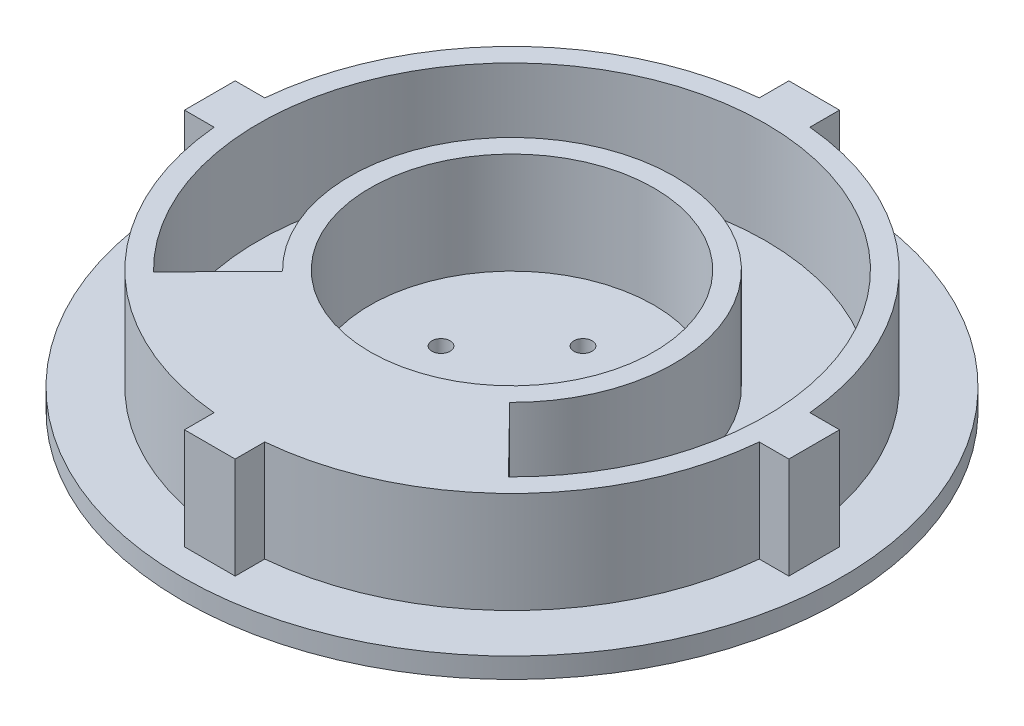
ISO-10303-21;
HEADER;
FILE_DESCRIPTION(('STEP AP214'),'2;1');
FILE_NAME('part.step','',(''),(''),'','','');
FILE_SCHEMA(('AUTOMOTIVE_DESIGN { 1 0 10303 214 1 1 1 1 }'));
ENDSEC;
DATA;
#1=APPLICATION_CONTEXT('core data for automotive mechanical design processes');
#2=APPLICATION_PROTOCOL_DEFINITION('international standard','automotive_design',2000,#1);
#3=PRODUCT_CONTEXT('',#1,'mechanical');
#4=PRODUCT('Part','Part','',(#3));
#5=PRODUCT_RELATED_PRODUCT_CATEGORY('part','',(#4));
#6=PRODUCT_DEFINITION_FORMATION('','',#4);
#7=PRODUCT_DEFINITION_CONTEXT('part definition',#1,'design');
#8=PRODUCT_DEFINITION('design','',#6,#7);
#9=PRODUCT_DEFINITION_SHAPE('','',#8);
#10=(LENGTH_UNIT() NAMED_UNIT(*) SI_UNIT(.MILLI.,.METRE.));
#11=(NAMED_UNIT(*) PLANE_ANGLE_UNIT() SI_UNIT($,.RADIAN.));
#12=(NAMED_UNIT(*) SI_UNIT($,.STERADIAN.) SOLID_ANGLE_UNIT());
#13=UNCERTAINTY_MEASURE_WITH_UNIT(LENGTH_MEASURE(1.E-05),#10,'distance_accuracy_value','');
#14=(GEOMETRIC_REPRESENTATION_CONTEXT(3) GLOBAL_UNCERTAINTY_ASSIGNED_CONTEXT((#13)) GLOBAL_UNIT_ASSIGNED_CONTEXT((#10,
#11,#12)) REPRESENTATION_CONTEXT('',''));
#15=CARTESIAN_POINT('',(0.,0.,0.));
#16=DIRECTION('',(0.,0.,1.));
#17=DIRECTION('',(1.,0.,0.));
#18=AXIS2_PLACEMENT_3D('',#15,#16,#17);
#19=CARTESIAN_POINT('',(0.,10.,0.));
#20=DIRECTION('',(0.,-1.,0.));
#21=DIRECTION('',(0.,0.,-1.));
#22=AXIS2_PLACEMENT_3D('',#19,#20,#21);
#23=CYLINDRICAL_SURFACE('',#22,27.);
#24=DIRECTION('',(0.,-1.,0.));
#25=VECTOR('',#24,1.);
#26=CARTESIAN_POINT('',(-26.8840101175404,10.,-2.49999999999735));
#27=LINE('',#26,#25);
#28=CARTESIAN_POINT('',(-26.8840101175404,10.,-2.49999999999735));
#29=VERTEX_POINT('',#28);
#30=CARTESIAN_POINT('',(-26.8840101175404,0.,-2.49999999999735));
#31=VERTEX_POINT('',#30);
#32=EDGE_CURVE('E218',#29,#31,#27,.T.);
#33=ORIENTED_EDGE('',*,*,#32,.F.);
#34=CARTESIAN_POINT('',(0.,10.,0.));
#35=DIRECTION('',(0.,1.,0.));
#36=DIRECTION('',(0.,0.,1.));
#37=AXIS2_PLACEMENT_3D('',#34,#35,#36);
#38=CIRCLE('',#37,27.);
#39=CARTESIAN_POINT('',(-2.5,10.,-26.8840101175401));
#40=VERTEX_POINT('',#39);
#41=EDGE_CURVE('E47',#40,#29,#38,.T.);
#42=ORIENTED_EDGE('',*,*,#41,.F.);
#43=DIRECTION('',(0.,-1.,0.));
#44=VECTOR('',#43,1.);
#45=CARTESIAN_POINT('',(-2.5,10.,-26.8840101175401));
#46=LINE('',#45,#44);
#47=CARTESIAN_POINT('',(-2.5,0.,-26.8840101175401));
#48=VERTEX_POINT('',#47);
#49=EDGE_CURVE('E322',#48,#40,#46,.F.);
#50=ORIENTED_EDGE('',*,*,#49,.F.);
#51=CARTESIAN_POINT('',(0.,0.,0.));
#52=DIRECTION('',(0.,1.,0.));
#53=DIRECTION('',(0.,0.,1.));
#54=AXIS2_PLACEMENT_3D('',#51,#52,#53);
#55=CIRCLE('',#54,27.);
#56=EDGE_CURVE('E359',#48,#31,#55,.T.);
#57=ORIENTED_EDGE('',*,*,#56,.T.);
#58=EDGE_LOOP('',(#33,#42,#50,#57));
#59=FACE_BOUND('',#58,.T.);
#60=ADVANCED_FACE('F39',(#59),#23,.T.);
#61=DIRECTION('',(0.,-1.,0.));
#62=VECTOR('',#61,1.);
#63=CARTESIAN_POINT('',(-26.8840101175399,10.,2.50000000000265));
#64=LINE('',#63,#62);
#65=CARTESIAN_POINT('',(-26.8840101175399,0.,2.50000000000265));
#66=VERTEX_POINT('',#65);
#67=CARTESIAN_POINT('',(-26.8840101175399,10.,2.50000000000265));
#68=VERTEX_POINT('',#67);
#69=EDGE_CURVE('E193',#66,#68,#64,.F.);
#70=ORIENTED_EDGE('',*,*,#69,.F.);
#71=CARTESIAN_POINT('',(-2.49999999999417,0.,26.8840101175407));
#72=VERTEX_POINT('',#71);
#73=EDGE_CURVE('E395',#66,#72,#55,.T.);
#74=ORIENTED_EDGE('',*,*,#73,.T.);
#75=DIRECTION('',(0.,-1.,0.));
#76=VECTOR('',#75,1.);
#77=CARTESIAN_POINT('',(-2.49999999999417,10.,26.8840101175407));
#78=LINE('',#77,#76);
#79=CARTESIAN_POINT('',(-2.49999999999417,10.,26.8840101175407));
#80=VERTEX_POINT('',#79);
#81=EDGE_CURVE('E255',#80,#72,#78,.T.);
#82=ORIENTED_EDGE('',*,*,#81,.F.);
#83=EDGE_CURVE('E392',#68,#80,#38,.T.);
#84=ORIENTED_EDGE('',*,*,#83,.F.);
#85=EDGE_LOOP('',(#70,#74,#82,#84));
#86=FACE_BOUND('',#85,.T.);
#87=ADVANCED_FACE('F437',(#86),#23,.T.);
#88=CARTESIAN_POINT('',(0.,0.,0.));
#89=DIRECTION('',(0.,-1.,0.));
#90=DIRECTION('',(0.,0.,-1.));
#91=AXIS2_PLACEMENT_3D('',#88,#89,#90);
#92=PLANE('',#91);
#93=CARTESIAN_POINT('',(0.,0.,0.));
#94=DIRECTION('',(0.,-1.,0.));
#95=DIRECTION('',(0.,0.,-1.));
#96=AXIS2_PLACEMENT_3D('',#93,#94,#95);
#97=CIRCLE('',#96,32.5);
#98=CARTESIAN_POINT('',(0.,0.,-32.5));
#99=VERTEX_POINT('',#98);
#100=EDGE_CURVE('E330',#99,#99,#97,.T.);
#101=ORIENTED_EDGE('',*,*,#100,.F.);
#102=EDGE_LOOP('',(#101));
#103=FACE_BOUND('',#102,.T.);
#104=DIRECTION('',(-1.,0.,0.));
#105=VECTOR('',#104,1.);
#106=CARTESIAN_POINT('',(-29.7999999999968,0.,-2.49999999999735));
#107=LINE('',#106,#105);
#108=CARTESIAN_POINT('',(-29.7999999999968,0.,-2.49999999999735));
#109=VERTEX_POINT('',#108);
#110=EDGE_CURVE('E190',#31,#109,#107,.T.);
#111=ORIENTED_EDGE('',*,*,#110,.F.);
#112=ORIENTED_EDGE('',*,*,#56,.F.);
#113=DIRECTION('',(0.,0.,1.));
#114=VECTOR('',#113,1.);
#115=CARTESIAN_POINT('',(-2.5,0.,-29.8));
#116=LINE('',#115,#114);
#117=CARTESIAN_POINT('',(-2.5,0.,-29.8));
#118=VERTEX_POINT('',#117);
#119=EDGE_CURVE('E302',#118,#48,#116,.T.);
#120=ORIENTED_EDGE('',*,*,#119,.F.);
#121=DIRECTION('',(-1.,0.,0.));
#122=VECTOR('',#121,1.);
#123=CARTESIAN_POINT('',(-2.5,0.,-29.8));
#124=LINE('',#123,#122);
#125=CARTESIAN_POINT('',(2.5,0.,-29.8));
#126=VERTEX_POINT('',#125);
#127=EDGE_CURVE('E297',#126,#118,#124,.T.);
#128=ORIENTED_EDGE('',*,*,#127,.F.);
#129=DIRECTION('',(0.,0.,-1.));
#130=VECTOR('',#129,1.);
#131=CARTESIAN_POINT('',(2.5,0.,0.));
#132=LINE('',#131,#130);
#133=CARTESIAN_POINT('',(2.5,0.,-26.8840101175401));
#134=VERTEX_POINT('',#133);
#135=EDGE_CURVE('E11',#134,#126,#132,.T.);
#136=ORIENTED_EDGE('',*,*,#135,.F.);
#137=CARTESIAN_POINT('',(26.8840101175398,0.,-2.50000000000318));
#138=VERTEX_POINT('',#137);
#139=EDGE_CURVE('E335',#138,#134,#55,.T.);
#140=ORIENTED_EDGE('',*,*,#139,.F.);
#141=DIRECTION('',(-1.,0.,0.));
#142=VECTOR('',#141,1.);
#143=CARTESIAN_POINT('',(29.8000000000026,0.,-2.50000000000318));
#144=LINE('',#143,#142);
#145=CARTESIAN_POINT('',(29.8000000000026,0.,-2.50000000000318));
#146=VERTEX_POINT('',#145);
#147=EDGE_CURVE('E264',#146,#138,#144,.T.);
#148=ORIENTED_EDGE('',*,*,#147,.F.);
#149=DIRECTION('',(0.,0.,-1.));
#150=VECTOR('',#149,1.);
#151=CARTESIAN_POINT('',(29.8000000000026,0.,-2.50000000000318));
#152=LINE('',#151,#150);
#153=CARTESIAN_POINT('',(29.8000000000026,0.,2.49999999999682));
#154=VERTEX_POINT('',#153);
#155=EDGE_CURVE('E275',#154,#146,#152,.T.);
#156=ORIENTED_EDGE('',*,*,#155,.F.);
#157=DIRECTION('',(1.,0.,0.));
#158=VECTOR('',#157,1.);
#159=CARTESIAN_POINT('',(29.8000000000026,0.,2.49999999999682));
#160=LINE('',#159,#158);
#161=CARTESIAN_POINT('',(26.8840101175404,0.,2.49999999999682));
#162=VERTEX_POINT('',#161);
#163=EDGE_CURVE('E259',#162,#154,#160,.T.);
#164=ORIENTED_EDGE('',*,*,#163,.F.);
#165=CARTESIAN_POINT('',(2.50000000000583,0.,26.8840101175396));
#166=VERTEX_POINT('',#165);
#167=EDGE_CURVE('E399',#166,#162,#55,.T.);
#168=ORIENTED_EDGE('',*,*,#167,.F.);
#169=DIRECTION('',(0.,0.,-1.));
#170=VECTOR('',#169,1.);
#171=CARTESIAN_POINT('',(2.50000000000583,0.,29.7999999999995));
#172=LINE('',#171,#170);
#173=CARTESIAN_POINT('',(2.50000000000583,0.,29.7999999999995));
#174=VERTEX_POINT('',#173);
#175=EDGE_CURVE('E226',#174,#166,#172,.T.);
#176=ORIENTED_EDGE('',*,*,#175,.F.);
#177=DIRECTION('',(1.,0.,0.));
#178=VECTOR('',#177,1.);
#179=CARTESIAN_POINT('',(2.50000000000583,0.,29.7999999999995));
#180=LINE('',#179,#178);
#181=CARTESIAN_POINT('',(-2.49999999999417,0.,29.7999999999995));
#182=VERTEX_POINT('',#181);
#183=EDGE_CURVE('E237',#182,#174,#180,.T.);
#184=ORIENTED_EDGE('',*,*,#183,.F.);
#185=DIRECTION('',(0.,0.,1.));
#186=VECTOR('',#185,1.);
#187=CARTESIAN_POINT('',(-2.49999999999417,0.,29.7999999999995));
#188=LINE('',#187,#186);
#189=EDGE_CURVE('E221',#72,#182,#188,.T.);
#190=ORIENTED_EDGE('',*,*,#189,.F.);
#191=ORIENTED_EDGE('',*,*,#73,.F.);
#192=DIRECTION('',(1.,0.,0.));
#193=VECTOR('',#192,1.);
#194=CARTESIAN_POINT('',(-29.7999999999968,0.,2.50000000000265));
#195=LINE('',#194,#193);
#196=CARTESIAN_POINT('',(-29.7999999999968,0.,2.50000000000265));
#197=VERTEX_POINT('',#196);
#198=EDGE_CURVE('E59',#197,#66,#195,.T.);
#199=ORIENTED_EDGE('',*,*,#198,.F.);
#200=DIRECTION('',(0.,0.,1.));
#201=VECTOR('',#200,1.);
#202=CARTESIAN_POINT('',(-29.7999999999968,0.,2.50000000000265));
#203=LINE('',#202,#201);
#204=EDGE_CURVE('E54',#109,#197,#203,.T.);
#205=ORIENTED_EDGE('',*,*,#204,.F.);
#206=EDGE_LOOP('',(#111,#112,#120,#128,#136,#140,#148,#156,#164,#168,#176,#184,#190,#191,#199,#205));
#207=FACE_BOUND('',#206,.T.);
#208=ADVANCED_FACE('F412',(#103,#207),#92,.F.);
#209=DIRECTION('',(0.,-1.,0.));
#210=VECTOR('',#209,1.);
#211=CARTESIAN_POINT('',(2.50000000000583,10.,26.8840101175396));
#212=LINE('',#211,#210);
#213=CARTESIAN_POINT('',(2.50000000000583,10.,26.8840101175396));
#214=VERTEX_POINT('',#213);
#215=EDGE_CURVE('E251',#166,#214,#212,.F.);
#216=ORIENTED_EDGE('',*,*,#215,.F.);
#217=ORIENTED_EDGE('',*,*,#167,.T.);
#218=DIRECTION('',(0.,-1.,0.));
#219=VECTOR('',#218,1.);
#220=CARTESIAN_POINT('',(26.8840101175404,10.,2.49999999999682));
#221=LINE('',#220,#219);
#222=CARTESIAN_POINT('',(26.8840101175404,10.,2.49999999999682));
#223=VERTEX_POINT('',#222);
#224=EDGE_CURVE('E293',#223,#162,#221,.T.);
#225=ORIENTED_EDGE('',*,*,#224,.F.);
#226=EDGE_CURVE('E418',#214,#223,#38,.T.);
#227=ORIENTED_EDGE('',*,*,#226,.F.);
#228=EDGE_LOOP('',(#216,#217,#225,#227));
#229=FACE_BOUND('',#228,.T.);
#230=ADVANCED_FACE('F410',(#229),#23,.T.);
#231=DIRECTION('',(0.,-1.,0.));
#232=VECTOR('',#231,1.);
#233=CARTESIAN_POINT('',(26.8840101175398,10.,-2.50000000000318));
#234=LINE('',#233,#232);
#235=CARTESIAN_POINT('',(26.8840101175398,10.,-2.50000000000318));
#236=VERTEX_POINT('',#235);
#237=EDGE_CURVE('E289',#138,#236,#234,.F.);
#238=ORIENTED_EDGE('',*,*,#237,.F.);
#239=ORIENTED_EDGE('',*,*,#139,.T.);
#240=DIRECTION('',(0.,-1.,0.));
#241=VECTOR('',#240,1.);
#242=CARTESIAN_POINT('',(2.5,10.,-26.8840101175401));
#243=LINE('',#242,#241);
#244=CARTESIAN_POINT('',(2.5,10.,-26.8840101175401));
#245=VERTEX_POINT('',#244);
#246=EDGE_CURVE('E326',#245,#134,#243,.T.);
#247=ORIENTED_EDGE('',*,*,#246,.F.);
#248=EDGE_CURVE('E387',#236,#245,#38,.T.);
#249=ORIENTED_EDGE('',*,*,#248,.F.);
#250=EDGE_LOOP('',(#238,#239,#247,#249));
#251=FACE_BOUND('',#250,.T.);
#252=ADVANCED_FACE('F426',(#251),#23,.T.);
#253=CARTESIAN_POINT('',(0.,10.,0.));
#254=DIRECTION('',(0.,1.,0.));
#255=DIRECTION('',(0.,0.,1.));
#256=AXIS2_PLACEMENT_3D('',#253,#254,#255);
#257=PLANE('',#256);
#258=ORIENTED_EDGE('',*,*,#41,.T.);
#259=DIRECTION('',(-1.,0.,0.));
#260=VECTOR('',#259,1.);
#261=CARTESIAN_POINT('',(-29.7999999999968,10.,-2.49999999999735));
#262=LINE('',#261,#260);
#263=CARTESIAN_POINT('',(-29.7999999999968,10.,-2.49999999999735));
#264=VERTEX_POINT('',#263);
#265=EDGE_CURVE('E174',#29,#264,#262,.T.);
#266=ORIENTED_EDGE('',*,*,#265,.T.);
#267=DIRECTION('',(0.,0.,1.));
#268=VECTOR('',#267,1.);
#269=CARTESIAN_POINT('',(-29.7999999999968,10.,2.50000000000265));
#270=LINE('',#269,#268);
#271=CARTESIAN_POINT('',(-29.7999999999968,10.,2.50000000000265));
#272=VERTEX_POINT('',#271);
#273=EDGE_CURVE('E180',#264,#272,#270,.T.);
#274=ORIENTED_EDGE('',*,*,#273,.T.);
#275=DIRECTION('',(1.,0.,0.));
#276=VECTOR('',#275,1.);
#277=CARTESIAN_POINT('',(-29.7999999999968,10.,2.50000000000265));
#278=LINE('',#277,#276);
#279=EDGE_CURVE('E200',#272,#68,#278,.T.);
#280=ORIENTED_EDGE('',*,*,#279,.T.);
#281=ORIENTED_EDGE('',*,*,#83,.T.);
#282=DIRECTION('',(0.,0.,1.));
#283=VECTOR('',#282,1.);
#284=CARTESIAN_POINT('',(-2.49999999999417,10.,29.7999999999995));
#285=LINE('',#284,#283);
#286=CARTESIAN_POINT('',(-2.49999999999417,10.,29.7999999999995));
#287=VERTEX_POINT('',#286);
#288=EDGE_CURVE('E222',#80,#287,#285,.T.);
#289=ORIENTED_EDGE('',*,*,#288,.T.);
#290=DIRECTION('',(1.,0.,0.));
#291=VECTOR('',#290,1.);
#292=CARTESIAN_POINT('',(2.50000000000583,10.,29.7999999999995));
#293=LINE('',#292,#291);
#294=CARTESIAN_POINT('',(2.50000000000583,10.,29.7999999999995));
#295=VERTEX_POINT('',#294);
#296=EDGE_CURVE('E225',#287,#295,#293,.T.);
#297=ORIENTED_EDGE('',*,*,#296,.T.);
#298=DIRECTION('',(0.,0.,-1.));
#299=VECTOR('',#298,1.);
#300=CARTESIAN_POINT('',(2.50000000000583,10.,29.7999999999995));
#301=LINE('',#300,#299);
#302=EDGE_CURVE('E229',#295,#214,#301,.T.);
#303=ORIENTED_EDGE('',*,*,#302,.T.);
#304=ORIENTED_EDGE('',*,*,#226,.T.);
#305=DIRECTION('',(1.,0.,0.));
#306=VECTOR('',#305,1.);
#307=CARTESIAN_POINT('',(29.8000000000026,10.,2.49999999999682));
#308=LINE('',#307,#306);
#309=CARTESIAN_POINT('',(29.8000000000026,10.,2.49999999999682));
#310=VERTEX_POINT('',#309);
#311=EDGE_CURVE('E260',#223,#310,#308,.T.);
#312=ORIENTED_EDGE('',*,*,#311,.T.);
#313=DIRECTION('',(0.,0.,-1.));
#314=VECTOR('',#313,1.);
#315=CARTESIAN_POINT('',(29.8000000000026,10.,-2.50000000000318));
#316=LINE('',#315,#314);
#317=CARTESIAN_POINT('',(29.8000000000026,10.,-2.50000000000318));
#318=VERTEX_POINT('',#317);
#319=EDGE_CURVE('E263',#310,#318,#316,.T.);
#320=ORIENTED_EDGE('',*,*,#319,.T.);
#321=DIRECTION('',(-1.,0.,0.));
#322=VECTOR('',#321,1.);
#323=CARTESIAN_POINT('',(29.8000000000026,10.,-2.50000000000318));
#324=LINE('',#323,#322);
#325=EDGE_CURVE('E267',#318,#236,#324,.T.);
#326=ORIENTED_EDGE('',*,*,#325,.T.);
#327=ORIENTED_EDGE('',*,*,#248,.T.);
#328=DIRECTION('',(0.,0.,-1.));
#329=VECTOR('',#328,1.);
#330=CARTESIAN_POINT('',(2.5,10.,-29.8));
#331=LINE('',#330,#329);
#332=CARTESIAN_POINT('',(2.5,10.,-29.8));
#333=VERTEX_POINT('',#332);
#334=EDGE_CURVE('E298',#245,#333,#331,.T.);
#335=ORIENTED_EDGE('',*,*,#334,.T.);
#336=DIRECTION('',(-1.,0.,0.));
#337=VECTOR('',#336,1.);
#338=CARTESIAN_POINT('',(-2.5,10.,-29.8));
#339=LINE('',#338,#337);
#340=CARTESIAN_POINT('',(-2.5,10.,-29.8));
#341=VERTEX_POINT('',#340);
#342=EDGE_CURVE('E301',#333,#341,#339,.T.);
#343=ORIENTED_EDGE('',*,*,#342,.T.);
#344=DIRECTION('',(0.,0.,1.));
#345=VECTOR('',#344,1.);
#346=CARTESIAN_POINT('',(-2.5,10.,-29.8));
#347=LINE('',#346,#345);
#348=EDGE_CURVE('E305',#341,#40,#347,.T.);
#349=ORIENTED_EDGE('',*,*,#348,.T.);
#350=EDGE_LOOP('',(#258,#266,#274,#280,#281,#289,#297,#303,#304,#312,#320,#326,#327,#335,#343,#349));
#351=FACE_BOUND('',#350,.T.);
#352=CARTESIAN_POINT('',(0.,10.,0.));
#353=DIRECTION('',(0.,1.,0.));
#354=DIRECTION('',(0.,0.,1.));
#355=AXIS2_PLACEMENT_3D('',#352,#353,#354);
#356=CIRCLE('',#355,14.);
#357=CARTESIAN_POINT('',(0.,10.,14.));
#358=VERTEX_POINT('',#357);
#359=EDGE_CURVE('E383',#358,#358,#356,.T.);
#360=ORIENTED_EDGE('',*,*,#359,.F.);
#361=EDGE_LOOP('',(#360));
#362=FACE_BOUND('',#361,.T.);
#363=DIRECTION('',(0.7,0.,-0.714142842854285));
#364=VECTOR('',#363,1.);
#365=CARTESIAN_POINT('',(-17.5,10.,17.8535710713571));
#366=LINE('',#365,#364);
#367=CARTESIAN_POINT('',(-17.5,10.,17.8535710713571));
#368=VERTEX_POINT('',#367);
#369=CARTESIAN_POINT('',(-11.2,10.,11.4262854856686));
#370=VERTEX_POINT('',#369);
#371=EDGE_CURVE('E342',#368,#370,#366,.T.);
#372=ORIENTED_EDGE('',*,*,#371,.F.);
#373=CARTESIAN_POINT('',(0.,10.,0.));
#374=DIRECTION('',(0.,1.,0.));
#375=DIRECTION('',(0.,0.,1.));
#376=AXIS2_PLACEMENT_3D('',#373,#374,#375);
#377=CIRCLE('',#376,25.);
#378=CARTESIAN_POINT('',(17.5,10.,17.8535710713571));
#379=VERTEX_POINT('',#378);
#380=EDGE_CURVE('E339',#379,#368,#377,.T.);
#381=ORIENTED_EDGE('',*,*,#380,.F.);
#382=DIRECTION('',(0.7,0.,0.714142842854285));
#383=VECTOR('',#382,1.);
#384=CARTESIAN_POINT('',(17.5,10.,17.8535710713571));
#385=LINE('',#384,#383);
#386=CARTESIAN_POINT('',(11.2,10.,11.4262854856686));
#387=VERTEX_POINT('',#386);
#388=EDGE_CURVE('E350',#387,#379,#385,.T.);
#389=ORIENTED_EDGE('',*,*,#388,.F.);
#390=CARTESIAN_POINT('',(0.,10.,0.));
#391=DIRECTION('',(0.,-1.,0.));
#392=DIRECTION('',(0.,0.,1.));
#393=AXIS2_PLACEMENT_3D('',#390,#391,#392);
#394=CIRCLE('',#393,16.);
#395=EDGE_CURVE('E346',#370,#387,#394,.T.);
#396=ORIENTED_EDGE('',*,*,#395,.F.);
#397=EDGE_LOOP('',(#372,#381,#389,#396));
#398=FACE_BOUND('',#397,.T.);
#399=ADVANCED_FACE('F176',(#351,#362,#398),#257,.T.);
#400=CARTESIAN_POINT('',(0.,10.,0.));
#401=DIRECTION('',(0.,-1.,0.));
#402=DIRECTION('',(0.,0.,-1.));
#403=AXIS2_PLACEMENT_3D('',#400,#401,#402);
#404=CYLINDRICAL_SURFACE('',#403,14.);
#405=ORIENTED_EDGE('',*,*,#359,.T.);
#406=EDGE_LOOP('',(#405));
#407=FACE_BOUND('',#406,.T.);
#408=CARTESIAN_POINT('',(0.,0.,0.));
#409=DIRECTION('',(0.,1.,0.));
#410=DIRECTION('',(0.,0.,1.));
#411=AXIS2_PLACEMENT_3D('',#408,#409,#410);
#412=CIRCLE('',#411,14.);
#413=CARTESIAN_POINT('',(0.,0.,14.));
#414=VERTEX_POINT('',#413);
#415=EDGE_CURVE('E382',#414,#414,#412,.T.);
#416=ORIENTED_EDGE('',*,*,#415,.F.);
#417=EDGE_LOOP('',(#416));
#418=FACE_BOUND('',#417,.T.);
#419=ADVANCED_FACE('F447',(#407,#418),#404,.F.);
#420=CARTESIAN_POINT('',(0.,10.,0.));
#421=DIRECTION('',(0.,-1.,0.));
#422=DIRECTION('',(0.,0.,-1.));
#423=AXIS2_PLACEMENT_3D('',#420,#421,#422);
#424=CYLINDRICAL_SURFACE('',#423,25.);
#425=CARTESIAN_POINT('',(0.,0.,0.));
#426=DIRECTION('',(0.,1.,0.));
#427=DIRECTION('',(0.,0.,1.));
#428=AXIS2_PLACEMENT_3D('',#425,#426,#427);
#429=CIRCLE('',#428,25.);
#430=CARTESIAN_POINT('',(17.5,0.,17.8535710713571));
#431=VERTEX_POINT('',#430);
#432=CARTESIAN_POINT('',(-17.5,0.,17.8535710713571));
#433=VERTEX_POINT('',#432);
#434=EDGE_CURVE('E354',#431,#433,#429,.T.);
#435=ORIENTED_EDGE('',*,*,#434,.F.);
#436=DIRECTION('',(0.,-1.,0.));
#437=VECTOR('',#436,1.);
#438=CARTESIAN_POINT('',(17.5,10.,17.8535710713571));
#439=LINE('',#438,#437);
#440=EDGE_CURVE('E353',#379,#431,#439,.T.);
#441=ORIENTED_EDGE('',*,*,#440,.F.);
#442=ORIENTED_EDGE('',*,*,#380,.T.);
#443=DIRECTION('',(0.,-1.,0.));
#444=VECTOR('',#443,1.);
#445=CARTESIAN_POINT('',(-17.5,10.,17.8535710713571));
#446=LINE('',#445,#444);
#447=EDGE_CURVE('E378',#368,#433,#446,.T.);
#448=ORIENTED_EDGE('',*,*,#447,.T.);
#449=EDGE_LOOP('',(#435,#441,#442,#448));
#450=FACE_BOUND('',#449,.T.);
#451=ADVANCED_FACE('F482',(#450),#424,.F.);
#452=CARTESIAN_POINT('',(-17.5,10.,17.8535710713571));
#453=DIRECTION('',(-0.714142842854285,0.,-0.7));
#454=DIRECTION('',(-0.7,0.,0.714142842854285));
#455=AXIS2_PLACEMENT_3D('',#452,#453,#454);
#456=PLANE('',#455);
#457=DIRECTION('',(0.7,0.,-0.714142842854285));
#458=VECTOR('',#457,1.);
#459=CARTESIAN_POINT('',(-17.5,0.,17.8535710713571));
#460=LINE('',#459,#458);
#461=CARTESIAN_POINT('',(-11.2,0.,11.4262854856686));
#462=VERTEX_POINT('',#461);
#463=EDGE_CURVE('E358',#433,#462,#460,.T.);
#464=ORIENTED_EDGE('',*,*,#463,.F.);
#465=ORIENTED_EDGE('',*,*,#447,.F.);
#466=ORIENTED_EDGE('',*,*,#371,.T.);
#467=DIRECTION('',(0.,-1.,0.));
#468=VECTOR('',#467,1.);
#469=CARTESIAN_POINT('',(-11.2,10.,11.4262854856686));
#470=LINE('',#469,#468);
#471=EDGE_CURVE('E375',#370,#462,#470,.T.);
#472=ORIENTED_EDGE('',*,*,#471,.T.);
#473=EDGE_LOOP('',(#464,#465,#466,#472));
#474=FACE_BOUND('',#473,.T.);
#475=ADVANCED_FACE('F486',(#474),#456,.T.);
#476=CARTESIAN_POINT('',(0.,10.,0.));
#477=DIRECTION('',(0.,-1.,0.));
#478=DIRECTION('',(0.,0.,-1.));
#479=AXIS2_PLACEMENT_3D('',#476,#477,#478);
#480=CYLINDRICAL_SURFACE('',#479,16.);
#481=CARTESIAN_POINT('',(0.,0.,0.));
#482=DIRECTION('',(0.,-1.,0.));
#483=DIRECTION('',(0.,0.,1.));
#484=AXIS2_PLACEMENT_3D('',#481,#482,#483);
#485=CIRCLE('',#484,16.);
#486=CARTESIAN_POINT('',(11.2,0.,11.4262854856686));
#487=VERTEX_POINT('',#486);
#488=EDGE_CURVE('E363',#462,#487,#485,.T.);
#489=ORIENTED_EDGE('',*,*,#488,.F.);
#490=ORIENTED_EDGE('',*,*,#471,.F.);
#491=ORIENTED_EDGE('',*,*,#395,.T.);
#492=DIRECTION('',(0.,-1.,0.));
#493=VECTOR('',#492,1.);
#494=CARTESIAN_POINT('',(11.2,10.,11.4262854856686));
#495=LINE('',#494,#493);
#496=EDGE_CURVE('E372',#387,#487,#495,.T.);
#497=ORIENTED_EDGE('',*,*,#496,.T.);
#498=EDGE_LOOP('',(#489,#490,#491,#497));
#499=FACE_BOUND('',#498,.T.);
#500=ADVANCED_FACE('F472',(#499),#480,.T.);
#501=CARTESIAN_POINT('',(17.5,10.,17.8535710713571));
#502=DIRECTION('',(0.714142842854285,0.,-0.7));
#503=DIRECTION('',(-0.7,0.,-0.714142842854285));
#504=AXIS2_PLACEMENT_3D('',#501,#502,#503);
#505=PLANE('',#504);
#506=DIRECTION('',(0.7,0.,0.714142842854285));
#507=VECTOR('',#506,1.);
#508=CARTESIAN_POINT('',(17.5,0.,17.8535710713571));
#509=LINE('',#508,#507);
#510=EDGE_CURVE('E343',#487,#431,#509,.T.);
#511=ORIENTED_EDGE('',*,*,#510,.F.);
#512=ORIENTED_EDGE('',*,*,#496,.F.);
#513=ORIENTED_EDGE('',*,*,#388,.T.);
#514=ORIENTED_EDGE('',*,*,#440,.T.);
#515=EDGE_LOOP('',(#511,#512,#513,#514));
#516=FACE_BOUND('',#515,.T.);
#517=ADVANCED_FACE('F465',(#516),#505,.T.);
#518=ORIENTED_EDGE('',*,*,#510,.T.);
#519=ORIENTED_EDGE('',*,*,#434,.T.);
#520=ORIENTED_EDGE('',*,*,#463,.T.);
#521=ORIENTED_EDGE('',*,*,#488,.T.);
#522=EDGE_LOOP('',(#518,#519,#520,#521));
#523=FACE_BOUND('',#522,.T.);
#524=ADVANCED_FACE('F454',(#523),#92,.F.);
#525=CARTESIAN_POINT('',(0.,-2.,0.));
#526=DIRECTION('',(0.,-1.,0.));
#527=DIRECTION('',(0.,0.,-1.));
#528=AXIS2_PLACEMENT_3D('',#525,#526,#527);
#529=PLANE('',#528);
#530=CARTESIAN_POINT('',(0.,-2.,-7.));
#531=DIRECTION('',(0.,-1.,0.));
#532=DIRECTION('',(0.,0.,-1.));
#533=AXIS2_PLACEMENT_3D('',#530,#531,#532);
#534=CIRCLE('',#533,0.9);
#535=CARTESIAN_POINT('',(0.,-2.,-7.9));
#536=VERTEX_POINT('',#535);
#537=EDGE_CURVE('E735',#536,#536,#534,.T.);
#538=ORIENTED_EDGE('',*,*,#537,.F.);
#539=EDGE_LOOP('',(#538));
#540=FACE_BOUND('',#539,.T.);
#541=CARTESIAN_POINT('',(-7.,-2.,0.));
#542=DIRECTION('',(0.,-1.,0.));
#543=DIRECTION('',(0.,0.,-1.));
#544=AXIS2_PLACEMENT_3D('',#541,#542,#543);
#545=CIRCLE('',#544,0.9);
#546=CARTESIAN_POINT('',(-7.,-2.,-0.899999999999976));
#547=VERTEX_POINT('',#546);
#548=EDGE_CURVE('E744',#547,#547,#545,.T.);
#549=ORIENTED_EDGE('',*,*,#548,.F.);
#550=EDGE_LOOP('',(#549));
#551=FACE_BOUND('',#550,.T.);
#552=CARTESIAN_POINT('',(0.,-2.,7.));
#553=DIRECTION('',(0.,-1.,0.));
#554=DIRECTION('',(0.,0.,-1.));
#555=AXIS2_PLACEMENT_3D('',#552,#553,#554);
#556=CIRCLE('',#555,0.9);
#557=CARTESIAN_POINT('',(0.,-2.,6.1));
#558=VERTEX_POINT('',#557);
#559=EDGE_CURVE('E752',#558,#558,#556,.T.);
#560=ORIENTED_EDGE('',*,*,#559,.F.);
#561=EDGE_LOOP('',(#560));
#562=FACE_BOUND('',#561,.T.);
#563=CARTESIAN_POINT('',(7.,-2.,0.));
#564=DIRECTION('',(0.,-1.,0.));
#565=DIRECTION('',(0.,0.,-1.));
#566=AXIS2_PLACEMENT_3D('',#563,#564,#565);
#567=CIRCLE('',#566,0.9);
#568=CARTESIAN_POINT('',(7.,-2.,-0.900000000000073));
#569=VERTEX_POINT('',#568);
#570=EDGE_CURVE('E760',#569,#569,#567,.T.);
#571=ORIENTED_EDGE('',*,*,#570,.F.);
#572=EDGE_LOOP('',(#571));
#573=FACE_BOUND('',#572,.T.);
#574=CARTESIAN_POINT('',(0.,-2.,0.));
#575=DIRECTION('',(0.,-1.,0.));
#576=DIRECTION('',(0.,0.,-1.));
#577=AXIS2_PLACEMENT_3D('',#574,#575,#576);
#578=CIRCLE('',#577,32.5);
#579=CARTESIAN_POINT('',(0.,-2.,-32.5));
#580=VERTEX_POINT('',#579);
#581=EDGE_CURVE('E331',#580,#580,#578,.T.);
#582=ORIENTED_EDGE('',*,*,#581,.T.);
#583=EDGE_LOOP('',(#582));
#584=FACE_BOUND('',#583,.T.);
#585=ADVANCED_FACE('F464',(#540,#551,#562,#573,#584),#529,.T.);
#586=CARTESIAN_POINT('',(0.,-2.,0.));
#587=DIRECTION('',(0.,1.,0.));
#588=DIRECTION('',(0.,0.,1.));
#589=AXIS2_PLACEMENT_3D('',#586,#587,#588);
#590=CYLINDRICAL_SURFACE('',#589,32.5);
#591=ORIENTED_EDGE('',*,*,#581,.F.);
#592=EDGE_LOOP('',(#591));
#593=FACE_BOUND('',#592,.T.);
#594=ORIENTED_EDGE('',*,*,#100,.T.);
#595=EDGE_LOOP('',(#594));
#596=FACE_BOUND('',#595,.T.);
#597=ADVANCED_FACE('F461',(#593,#596),#590,.T.);
#598=CARTESIAN_POINT('',(0.,0.,-7.));
#599=DIRECTION('',(0.,-1.,0.));
#600=DIRECTION('',(0.,0.,-1.));
#601=AXIS2_PLACEMENT_3D('',#598,#599,#600);
#602=CIRCLE('',#601,0.9);
#603=CARTESIAN_POINT('',(0.,0.,-7.9));
#604=VERTEX_POINT('',#603);
#605=EDGE_CURVE('E208',#604,#604,#602,.F.);
#606=ORIENTED_EDGE('',*,*,#605,.F.);
#607=EDGE_LOOP('',(#606));
#608=FACE_BOUND('',#607,.T.);
#609=CARTESIAN_POINT('',(-7.,0.,0.));
#610=DIRECTION('',(0.,-1.,0.));
#611=DIRECTION('',(0.,0.,-1.));
#612=AXIS2_PLACEMENT_3D('',#609,#610,#611);
#613=CIRCLE('',#612,0.9);
#614=CARTESIAN_POINT('',(-7.,0.,-0.899999999999976));
#615=VERTEX_POINT('',#614);
#616=EDGE_CURVE('E741',#615,#615,#613,.F.);
#617=ORIENTED_EDGE('',*,*,#616,.F.);
#618=EDGE_LOOP('',(#617));
#619=FACE_BOUND('',#618,.T.);
#620=CARTESIAN_POINT('',(0.,0.,7.));
#621=DIRECTION('',(0.,-1.,0.));
#622=DIRECTION('',(0.,0.,-1.));
#623=AXIS2_PLACEMENT_3D('',#620,#621,#622);
#624=CIRCLE('',#623,0.9);
#625=CARTESIAN_POINT('',(0.,0.,6.1));
#626=VERTEX_POINT('',#625);
#627=EDGE_CURVE('E748',#626,#626,#624,.F.);
#628=ORIENTED_EDGE('',*,*,#627,.F.);
#629=EDGE_LOOP('',(#628));
#630=FACE_BOUND('',#629,.T.);
#631=CARTESIAN_POINT('',(7.,0.,0.));
#632=DIRECTION('',(0.,-1.,0.));
#633=DIRECTION('',(0.,0.,-1.));
#634=AXIS2_PLACEMENT_3D('',#631,#632,#633);
#635=CIRCLE('',#634,0.9);
#636=CARTESIAN_POINT('',(7.,0.,-0.900000000000073));
#637=VERTEX_POINT('',#636);
#638=EDGE_CURVE('E756',#637,#637,#635,.F.);
#639=ORIENTED_EDGE('',*,*,#638,.F.);
#640=EDGE_LOOP('',(#639));
#641=FACE_BOUND('',#640,.T.);
#642=ORIENTED_EDGE('',*,*,#415,.T.);
#643=EDGE_LOOP('',(#642));
#644=FACE_BOUND('',#643,.T.);
#645=ADVANCED_FACE('F453',(#608,#619,#630,#641,#644),#92,.F.);
#646=CARTESIAN_POINT('',(2.5,10.,-29.8));
#647=DIRECTION('',(-1.,0.,0.));
#648=DIRECTION('',(0.,0.,1.));
#649=AXIS2_PLACEMENT_3D('',#646,#647,#648);
#650=PLANE('',#649);
#651=ORIENTED_EDGE('',*,*,#334,.F.);
#652=ORIENTED_EDGE('',*,*,#246,.T.);
#653=ORIENTED_EDGE('',*,*,#135,.T.);
#654=DIRECTION('',(0.,-1.,0.));
#655=VECTOR('',#654,1.);
#656=CARTESIAN_POINT('',(2.5,10.,-29.8));
#657=LINE('',#656,#655);
#658=EDGE_CURVE('E318',#333,#126,#657,.T.);
#659=ORIENTED_EDGE('',*,*,#658,.F.);
#660=EDGE_LOOP('',(#651,#652,#653,#659));
#661=FACE_BOUND('',#660,.T.);
#662=ADVANCED_FACE('F429',(#661),#650,.F.);
#663=CARTESIAN_POINT('',(-2.5,10.,-29.8));
#664=DIRECTION('',(1.,0.,0.));
#665=DIRECTION('',(0.,0.,-1.));
#666=AXIS2_PLACEMENT_3D('',#663,#664,#665);
#667=PLANE('',#666);
#668=ORIENTED_EDGE('',*,*,#119,.T.);
#669=ORIENTED_EDGE('',*,*,#49,.T.);
#670=ORIENTED_EDGE('',*,*,#348,.F.);
#671=DIRECTION('',(0.,-1.,0.));
#672=VECTOR('',#671,1.);
#673=CARTESIAN_POINT('',(-2.5,10.,-29.8));
#674=LINE('',#673,#672);
#675=EDGE_CURVE('E308',#341,#118,#674,.T.);
#676=ORIENTED_EDGE('',*,*,#675,.T.);
#677=EDGE_LOOP('',(#668,#669,#670,#676));
#678=FACE_BOUND('',#677,.T.);
#679=ADVANCED_FACE('F435',(#678),#667,.F.);
#680=CARTESIAN_POINT('',(-2.5,10.,-29.8));
#681=DIRECTION('',(0.,0.,1.));
#682=DIRECTION('',(1.,0.,0.));
#683=AXIS2_PLACEMENT_3D('',#680,#681,#682);
#684=PLANE('',#683);
#685=ORIENTED_EDGE('',*,*,#127,.T.);
#686=ORIENTED_EDGE('',*,*,#675,.F.);
#687=ORIENTED_EDGE('',*,*,#342,.F.);
#688=ORIENTED_EDGE('',*,*,#658,.T.);
#689=EDGE_LOOP('',(#685,#686,#687,#688));
#690=FACE_BOUND('',#689,.T.);
#691=ADVANCED_FACE('F431',(#690),#684,.F.);
#692=CARTESIAN_POINT('',(29.8000000000026,10.,2.49999999999682));
#693=DIRECTION('',(0.,0.,-1.));
#694=DIRECTION('',(-1.,0.,0.));
#695=AXIS2_PLACEMENT_3D('',#692,#693,#694);
#696=PLANE('',#695);
#697=ORIENTED_EDGE('',*,*,#311,.F.);
#698=ORIENTED_EDGE('',*,*,#224,.T.);
#699=ORIENTED_EDGE('',*,*,#163,.T.);
#700=DIRECTION('',(0.,-1.,0.));
#701=VECTOR('',#700,1.);
#702=CARTESIAN_POINT('',(29.8000000000026,10.,2.49999999999682));
#703=LINE('',#702,#701);
#704=EDGE_CURVE('E285',#310,#154,#703,.T.);
#705=ORIENTED_EDGE('',*,*,#704,.F.);
#706=EDGE_LOOP('',(#697,#698,#699,#705));
#707=FACE_BOUND('',#706,.T.);
#708=ADVANCED_FACE('F415',(#707),#696,.F.);
#709=CARTESIAN_POINT('',(29.8000000000026,10.,-2.50000000000318));
#710=DIRECTION('',(0.,0.,1.));
#711=DIRECTION('',(1.,0.,0.));
#712=AXIS2_PLACEMENT_3D('',#709,#710,#711);
#713=PLANE('',#712);
#714=ORIENTED_EDGE('',*,*,#147,.T.);
#715=ORIENTED_EDGE('',*,*,#237,.T.);
#716=ORIENTED_EDGE('',*,*,#325,.F.);
#717=DIRECTION('',(0.,-1.,0.));
#718=VECTOR('',#717,1.);
#719=CARTESIAN_POINT('',(29.8000000000026,10.,-2.50000000000318));
#720=LINE('',#719,#718);
#721=EDGE_CURVE('E271',#318,#146,#720,.T.);
#722=ORIENTED_EDGE('',*,*,#721,.T.);
#723=EDGE_LOOP('',(#714,#715,#716,#722));
#724=FACE_BOUND('',#723,.T.);
#725=ADVANCED_FACE('F603',(#724),#713,.F.);
#726=CARTESIAN_POINT('',(29.8000000000026,10.,-2.50000000000318));
#727=DIRECTION('',(-1.,0.,0.));
#728=DIRECTION('',(0.,0.,1.));
#729=AXIS2_PLACEMENT_3D('',#726,#727,#728);
#730=PLANE('',#729);
#731=ORIENTED_EDGE('',*,*,#155,.T.);
#732=ORIENTED_EDGE('',*,*,#721,.F.);
#733=ORIENTED_EDGE('',*,*,#319,.F.);
#734=ORIENTED_EDGE('',*,*,#704,.T.);
#735=EDGE_LOOP('',(#731,#732,#733,#734));
#736=FACE_BOUND('',#735,.T.);
#737=ADVANCED_FACE('F612',(#736),#730,.F.);
#738=CARTESIAN_POINT('',(-2.49999999999417,10.,29.7999999999995));
#739=DIRECTION('',(1.,0.,0.));
#740=DIRECTION('',(0.,0.,-1.));
#741=AXIS2_PLACEMENT_3D('',#738,#739,#740);
#742=PLANE('',#741);
#743=ORIENTED_EDGE('',*,*,#288,.F.);
#744=ORIENTED_EDGE('',*,*,#81,.T.);
#745=ORIENTED_EDGE('',*,*,#189,.T.);
#746=DIRECTION('',(0.,-1.,0.));
#747=VECTOR('',#746,1.);
#748=CARTESIAN_POINT('',(-2.49999999999417,10.,29.7999999999995));
#749=LINE('',#748,#747);
#750=EDGE_CURVE('E247',#287,#182,#749,.T.);
#751=ORIENTED_EDGE('',*,*,#750,.F.);
#752=EDGE_LOOP('',(#743,#744,#745,#751));
#753=FACE_BOUND('',#752,.T.);
#754=ADVANCED_FACE('F622',(#753),#742,.F.);
#755=CARTESIAN_POINT('',(2.50000000000583,10.,29.7999999999995));
#756=DIRECTION('',(-1.,0.,0.));
#757=DIRECTION('',(0.,0.,1.));
#758=AXIS2_PLACEMENT_3D('',#755,#756,#757);
#759=PLANE('',#758);
#760=ORIENTED_EDGE('',*,*,#175,.T.);
#761=ORIENTED_EDGE('',*,*,#215,.T.);
#762=ORIENTED_EDGE('',*,*,#302,.F.);
#763=DIRECTION('',(0.,-1.,0.));
#764=VECTOR('',#763,1.);
#765=CARTESIAN_POINT('',(2.50000000000583,10.,29.7999999999995));
#766=LINE('',#765,#764);
#767=EDGE_CURVE('E233',#295,#174,#766,.T.);
#768=ORIENTED_EDGE('',*,*,#767,.T.);
#769=EDGE_LOOP('',(#760,#761,#762,#768));
#770=FACE_BOUND('',#769,.T.);
#771=ADVANCED_FACE('F632',(#770),#759,.F.);
#772=CARTESIAN_POINT('',(2.50000000000583,10.,29.7999999999995));
#773=DIRECTION('',(0.,0.,-1.));
#774=DIRECTION('',(-1.,0.,0.));
#775=AXIS2_PLACEMENT_3D('',#772,#773,#774);
#776=PLANE('',#775);
#777=ORIENTED_EDGE('',*,*,#183,.T.);
#778=ORIENTED_EDGE('',*,*,#767,.F.);
#779=ORIENTED_EDGE('',*,*,#296,.F.);
#780=ORIENTED_EDGE('',*,*,#750,.T.);
#781=EDGE_LOOP('',(#777,#778,#779,#780));
#782=FACE_BOUND('',#781,.T.);
#783=ADVANCED_FACE('F642',(#782),#776,.F.);
#784=CARTESIAN_POINT('',(-29.7999999999968,10.,-2.49999999999735));
#785=DIRECTION('',(0.,0.,1.));
#786=DIRECTION('',(1.,0.,0.));
#787=AXIS2_PLACEMENT_3D('',#784,#785,#786);
#788=PLANE('',#787);
#789=ORIENTED_EDGE('',*,*,#265,.F.);
#790=ORIENTED_EDGE('',*,*,#32,.T.);
#791=ORIENTED_EDGE('',*,*,#110,.T.);
#792=DIRECTION('',(0.,-1.,0.));
#793=VECTOR('',#792,1.);
#794=CARTESIAN_POINT('',(-29.7999999999968,10.,-2.49999999999735));
#795=LINE('',#794,#793);
#796=EDGE_CURVE('E188',#264,#109,#795,.T.);
#797=ORIENTED_EDGE('',*,*,#796,.F.);
#798=EDGE_LOOP('',(#789,#790,#791,#797));
#799=FACE_BOUND('',#798,.T.);
#800=ADVANCED_FACE('F189',(#799),#788,.F.);
#801=CARTESIAN_POINT('',(-29.7999999999968,10.,2.50000000000265));
#802=DIRECTION('',(0.,0.,-1.));
#803=DIRECTION('',(-1.,0.,0.));
#804=AXIS2_PLACEMENT_3D('',#801,#802,#803);
#805=PLANE('',#804);
#806=ORIENTED_EDGE('',*,*,#198,.T.);
#807=ORIENTED_EDGE('',*,*,#69,.T.);
#808=ORIENTED_EDGE('',*,*,#279,.F.);
#809=DIRECTION('',(0.,-1.,0.));
#810=VECTOR('',#809,1.);
#811=CARTESIAN_POINT('',(-29.7999999999968,10.,2.50000000000265));
#812=LINE('',#811,#810);
#813=EDGE_CURVE('E194',#272,#197,#812,.T.);
#814=ORIENTED_EDGE('',*,*,#813,.T.);
#815=EDGE_LOOP('',(#806,#807,#808,#814));
#816=FACE_BOUND('',#815,.T.);
#817=ADVANCED_FACE('F661',(#816),#805,.F.);
#818=CARTESIAN_POINT('',(-29.7999999999968,10.,2.50000000000265));
#819=DIRECTION('',(1.,0.,0.));
#820=DIRECTION('',(0.,0.,-1.));
#821=AXIS2_PLACEMENT_3D('',#818,#819,#820);
#822=PLANE('',#821);
#823=ORIENTED_EDGE('',*,*,#204,.T.);
#824=ORIENTED_EDGE('',*,*,#813,.F.);
#825=ORIENTED_EDGE('',*,*,#273,.F.);
#826=ORIENTED_EDGE('',*,*,#796,.T.);
#827=EDGE_LOOP('',(#823,#824,#825,#826));
#828=FACE_BOUND('',#827,.T.);
#829=ADVANCED_FACE('F196',(#828),#822,.F.);
#830=CARTESIAN_POINT('',(7.,10.001,0.));
#831=DIRECTION('',(0.,-1.,0.));
#832=DIRECTION('',(0.,0.,-1.));
#833=AXIS2_PLACEMENT_3D('',#830,#831,#832);
#834=CYLINDRICAL_SURFACE('',#833,0.9);
#835=ORIENTED_EDGE('',*,*,#570,.T.);
#836=EDGE_LOOP('',(#835));
#837=FACE_BOUND('',#836,.T.);
#838=ORIENTED_EDGE('',*,*,#638,.T.);
#839=EDGE_LOOP('',(#838));
#840=FACE_BOUND('',#839,.T.);
#841=ADVANCED_FACE('F679',(#837,#840),#834,.F.);
#842=CARTESIAN_POINT('',(0.,10.001,7.));
#843=DIRECTION('',(0.,-1.,0.));
#844=DIRECTION('',(0.,0.,-1.));
#845=AXIS2_PLACEMENT_3D('',#842,#843,#844);
#846=CYLINDRICAL_SURFACE('',#845,0.9);
#847=ORIENTED_EDGE('',*,*,#559,.T.);
#848=EDGE_LOOP('',(#847));
#849=FACE_BOUND('',#848,.T.);
#850=ORIENTED_EDGE('',*,*,#627,.T.);
#851=EDGE_LOOP('',(#850));
#852=FACE_BOUND('',#851,.T.);
#853=ADVANCED_FACE('F698',(#849,#852),#846,.F.);
#854=CARTESIAN_POINT('',(-7.,10.001,0.));
#855=DIRECTION('',(0.,-1.,0.));
#856=DIRECTION('',(0.,0.,-1.));
#857=AXIS2_PLACEMENT_3D('',#854,#855,#856);
#858=CYLINDRICAL_SURFACE('',#857,0.9);
#859=ORIENTED_EDGE('',*,*,#548,.T.);
#860=EDGE_LOOP('',(#859));
#861=FACE_BOUND('',#860,.T.);
#862=ORIENTED_EDGE('',*,*,#616,.T.);
#863=EDGE_LOOP('',(#862));
#864=FACE_BOUND('',#863,.T.);
#865=ADVANCED_FACE('F708',(#861,#864),#858,.F.);
#866=CARTESIAN_POINT('',(0.,10.001,-7.));
#867=DIRECTION('',(0.,-1.,0.));
#868=DIRECTION('',(0.,0.,-1.));
#869=AXIS2_PLACEMENT_3D('',#866,#867,#868);
#870=CYLINDRICAL_SURFACE('',#869,0.9);
#871=ORIENTED_EDGE('',*,*,#537,.T.);
#872=EDGE_LOOP('',(#871));
#873=FACE_BOUND('',#872,.T.);
#874=ORIENTED_EDGE('',*,*,#605,.T.);
#875=EDGE_LOOP('',(#874));
#876=FACE_BOUND('',#875,.T.);
#877=ADVANCED_FACE('F718',(#873,#876),#870,.F.);
#878=CLOSED_SHELL('',(#60,#87,#208,#230,#252,#399,#419,#451,#475,#500,#517,#524,#585,#597,#645,
#662,#679,#691,#708,#725,#737,#754,#771,#783,#800,#817,#829,#841,#853,#865,#877));
#879=MANIFOLD_SOLID_BREP('B2',#878);
#880=ADVANCED_BREP_SHAPE_REPRESENTATION('',(#18,#879),#14);
#881=SHAPE_DEFINITION_REPRESENTATION(#9,#880);
ENDSEC;
END-ISO-10303-21;
